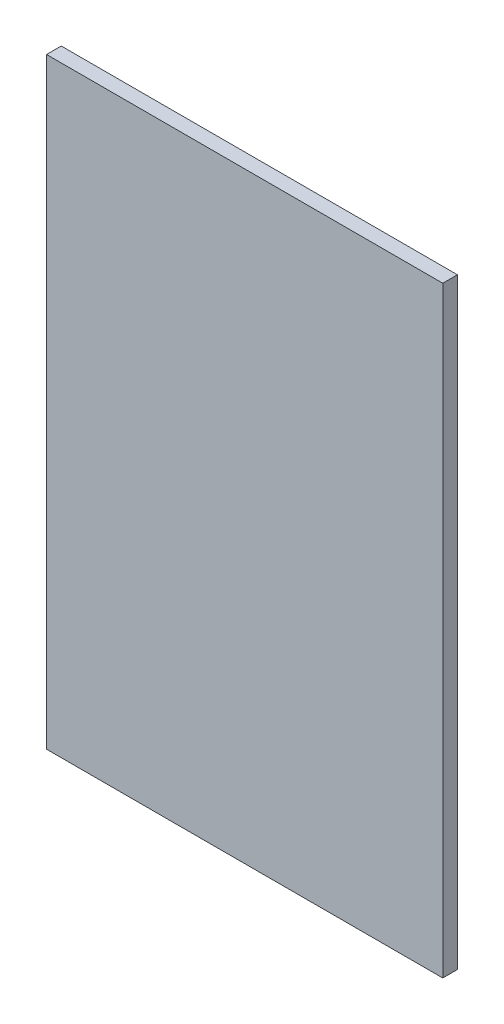
ISO-10303-21;
HEADER;
FILE_DESCRIPTION(('STEP AP214'),'2;1');
FILE_NAME('part.step','',(''),(''),'','','');
FILE_SCHEMA(('AUTOMOTIVE_DESIGN { 1 0 10303 214 1 1 1 1 }'));
ENDSEC;
DATA;
#1=APPLICATION_CONTEXT('core data for automotive mechanical design processes');
#2=APPLICATION_PROTOCOL_DEFINITION('international standard','automotive_design',2000,#1);
#3=PRODUCT_CONTEXT('',#1,'mechanical');
#4=PRODUCT('Part','Part','',(#3));
#5=PRODUCT_RELATED_PRODUCT_CATEGORY('part','',(#4));
#6=PRODUCT_DEFINITION_FORMATION('','',#4);
#7=PRODUCT_DEFINITION_CONTEXT('part definition',#1,'design');
#8=PRODUCT_DEFINITION('design','',#6,#7);
#9=PRODUCT_DEFINITION_SHAPE('','',#8);
#10=(LENGTH_UNIT() NAMED_UNIT(*) SI_UNIT(.MILLI.,.METRE.));
#11=(NAMED_UNIT(*) PLANE_ANGLE_UNIT() SI_UNIT($,.RADIAN.));
#12=(NAMED_UNIT(*) SI_UNIT($,.STERADIAN.) SOLID_ANGLE_UNIT());
#13=UNCERTAINTY_MEASURE_WITH_UNIT(LENGTH_MEASURE(1.E-05),#10,'distance_accuracy_value','');
#14=(GEOMETRIC_REPRESENTATION_CONTEXT(3) GLOBAL_UNCERTAINTY_ASSIGNED_CONTEXT((#13)) GLOBAL_UNIT_ASSIGNED_CONTEXT((#10,
#11,#12)) REPRESENTATION_CONTEXT('',''));
#15=CARTESIAN_POINT('',(0.,0.,0.));
#16=DIRECTION('',(0.,0.,1.));
#17=DIRECTION('',(1.,0.,0.));
#18=AXIS2_PLACEMENT_3D('',#15,#16,#17);
#19=CARTESIAN_POINT('',(0.,0.,0.01));
#20=DIRECTION('',(0.,0.,1.));
#21=DIRECTION('',(1.,0.,0.));
#22=AXIS2_PLACEMENT_3D('',#19,#20,#21);
#23=PLANE('',#22);
#24=DIRECTION('',(0.,-1.,0.));
#25=VECTOR('',#24,1.);
#26=CARTESIAN_POINT('',(-0.135,0.205,0.01));
#27=LINE('',#26,#25);
#28=CARTESIAN_POINT('',(-0.135,0.205,0.01));
#29=VERTEX_POINT('',#28);
#30=CARTESIAN_POINT('',(-0.135,-0.205,0.01));
#31=VERTEX_POINT('',#30);
#32=EDGE_CURVE('E78',#29,#31,#27,.T.);
#33=ORIENTED_EDGE('',*,*,#32,.T.);
#34=DIRECTION('',(1.,0.,0.));
#35=VECTOR('',#34,1.);
#36=CARTESIAN_POINT('',(-0.135,-0.205,0.01));
#37=LINE('',#36,#35);
#38=CARTESIAN_POINT('',(0.135,-0.205,0.01));
#39=VERTEX_POINT('',#38);
#40=EDGE_CURVE('E76',#31,#39,#37,.T.);
#41=ORIENTED_EDGE('',*,*,#40,.T.);
#42=DIRECTION('',(0.,1.,0.));
#43=VECTOR('',#42,1.);
#44=CARTESIAN_POINT('',(0.135,-0.205,0.01));
#45=LINE('',#44,#43);
#46=CARTESIAN_POINT('',(0.135,0.205,0.01));
#47=VERTEX_POINT('',#46);
#48=EDGE_CURVE('E64',#39,#47,#45,.T.);
#49=ORIENTED_EDGE('',*,*,#48,.T.);
#50=DIRECTION('',(-1.,0.,0.));
#51=VECTOR('',#50,1.);
#52=CARTESIAN_POINT('',(0.135,0.205,0.01));
#53=LINE('',#52,#51);
#54=EDGE_CURVE('E11',#47,#29,#53,.T.);
#55=ORIENTED_EDGE('',*,*,#54,.T.);
#56=EDGE_LOOP('',(#33,#41,#49,#55));
#57=FACE_BOUND('',#56,.T.);
#58=ADVANCED_FACE('F17',(#57),#23,.T.);
#59=CARTESIAN_POINT('',(0.,0.,0.));
#60=DIRECTION('',(0.,0.,1.));
#61=DIRECTION('',(1.,0.,0.));
#62=AXIS2_PLACEMENT_3D('',#59,#60,#61);
#63=PLANE('',#62);
#64=DIRECTION('',(0.,-1.,0.));
#65=VECTOR('',#64,1.);
#66=CARTESIAN_POINT('',(-0.135,0.205,0.));
#67=LINE('',#66,#65);
#68=CARTESIAN_POINT('',(-0.135,0.205,0.));
#69=VERTEX_POINT('',#68);
#70=CARTESIAN_POINT('',(-0.135,-0.205,0.));
#71=VERTEX_POINT('',#70);
#72=EDGE_CURVE('E154',#69,#71,#67,.T.);
#73=ORIENTED_EDGE('',*,*,#72,.F.);
#74=DIRECTION('',(-1.,0.,0.));
#75=VECTOR('',#74,1.);
#76=CARTESIAN_POINT('',(0.135,0.205,0.));
#77=LINE('',#76,#75);
#78=CARTESIAN_POINT('',(0.135,0.205,0.));
#79=VERTEX_POINT('',#78);
#80=EDGE_CURVE('E20',#79,#69,#77,.T.);
#81=ORIENTED_EDGE('',*,*,#80,.F.);
#82=DIRECTION('',(0.,1.,0.));
#83=VECTOR('',#82,1.);
#84=CARTESIAN_POINT('',(0.135,-0.205,0.));
#85=LINE('',#84,#83);
#86=CARTESIAN_POINT('',(0.135,-0.205,0.));
#87=VERTEX_POINT('',#86);
#88=EDGE_CURVE('E83',#87,#79,#85,.T.);
#89=ORIENTED_EDGE('',*,*,#88,.F.);
#90=DIRECTION('',(1.,0.,0.));
#91=VECTOR('',#90,1.);
#92=CARTESIAN_POINT('',(-0.135,-0.205,0.));
#93=LINE('',#92,#91);
#94=EDGE_CURVE('E86',#71,#87,#93,.T.);
#95=ORIENTED_EDGE('',*,*,#94,.F.);
#96=EDGE_LOOP('',(#73,#81,#89,#95));
#97=FACE_BOUND('',#96,.T.);
#98=ADVANCED_FACE('F133',(#97),#63,.F.);
#99=CARTESIAN_POINT('',(0.135,0.205,0.));
#100=DIRECTION('',(0.,-1.,0.));
#101=DIRECTION('',(0.,0.,-1.));
#102=AXIS2_PLACEMENT_3D('',#99,#100,#101);
#103=PLANE('',#102);
#104=DIRECTION('',(0.,0.,1.));
#105=VECTOR('',#104,1.);
#106=CARTESIAN_POINT('',(0.135,0.205,0.));
#107=LINE('',#106,#105);
#108=EDGE_CURVE('E71',#79,#47,#107,.T.);
#109=ORIENTED_EDGE('',*,*,#108,.F.);
#110=ORIENTED_EDGE('',*,*,#80,.T.);
#111=DIRECTION('',(0.,0.,1.));
#112=VECTOR('',#111,1.);
#113=CARTESIAN_POINT('',(-0.135,0.205,0.));
#114=LINE('',#113,#112);
#115=EDGE_CURVE('E152',#69,#29,#114,.T.);
#116=ORIENTED_EDGE('',*,*,#115,.T.);
#117=ORIENTED_EDGE('',*,*,#54,.F.);
#118=EDGE_LOOP('',(#109,#110,#116,#117));
#119=FACE_BOUND('',#118,.T.);
#120=ADVANCED_FACE('F125',(#119),#103,.F.);
#121=CARTESIAN_POINT('',(0.135,-0.205,0.));
#122=DIRECTION('',(-1.,0.,0.));
#123=DIRECTION('',(0.,0.,1.));
#124=AXIS2_PLACEMENT_3D('',#121,#122,#123);
#125=PLANE('',#124);
#126=DIRECTION('',(0.,0.,1.));
#127=VECTOR('',#126,1.);
#128=CARTESIAN_POINT('',(0.135,-0.205,0.));
#129=LINE('',#128,#127);
#130=EDGE_CURVE('E69',#87,#39,#129,.T.);
#131=ORIENTED_EDGE('',*,*,#130,.F.);
#132=ORIENTED_EDGE('',*,*,#88,.T.);
#133=ORIENTED_EDGE('',*,*,#108,.T.);
#134=ORIENTED_EDGE('',*,*,#48,.F.);
#135=EDGE_LOOP('',(#131,#132,#133,#134));
#136=FACE_BOUND('',#135,.T.);
#137=ADVANCED_FACE('F66',(#136),#125,.F.);
#138=CARTESIAN_POINT('',(-0.135,-0.205,0.));
#139=DIRECTION('',(0.,1.,0.));
#140=DIRECTION('',(1.,0.,0.));
#141=AXIS2_PLACEMENT_3D('',#138,#139,#140);
#142=PLANE('',#141);
#143=DIRECTION('',(0.,0.,1.));
#144=VECTOR('',#143,1.);
#145=CARTESIAN_POINT('',(-0.135,-0.205,0.));
#146=LINE('',#145,#144);
#147=EDGE_CURVE('E156',#71,#31,#146,.T.);
#148=ORIENTED_EDGE('',*,*,#147,.F.);
#149=ORIENTED_EDGE('',*,*,#94,.T.);
#150=ORIENTED_EDGE('',*,*,#130,.T.);
#151=ORIENTED_EDGE('',*,*,#40,.F.);
#152=EDGE_LOOP('',(#148,#149,#150,#151));
#153=FACE_BOUND('',#152,.T.);
#154=ADVANCED_FACE('F85',(#153),#142,.F.);
#155=CARTESIAN_POINT('',(-0.135,0.205,0.));
#156=DIRECTION('',(1.,0.,0.));
#157=DIRECTION('',(0.,1.,0.));
#158=AXIS2_PLACEMENT_3D('',#155,#156,#157);
#159=PLANE('',#158);
#160=ORIENTED_EDGE('',*,*,#115,.F.);
#161=ORIENTED_EDGE('',*,*,#72,.T.);
#162=ORIENTED_EDGE('',*,*,#147,.T.);
#163=ORIENTED_EDGE('',*,*,#32,.F.);
#164=EDGE_LOOP('',(#160,#161,#162,#163));
#165=FACE_BOUND('',#164,.T.);
#166=ADVANCED_FACE('F104',(#165),#159,.F.);
#167=CLOSED_SHELL('',(#58,#98,#120,#137,#154,#166));
#168=MANIFOLD_SOLID_BREP('B1',#167);
#169=ADVANCED_BREP_SHAPE_REPRESENTATION('',(#18,#168),#14);
#170=SHAPE_DEFINITION_REPRESENTATION(#9,#169);
ENDSEC;
END-ISO-10303-21;
